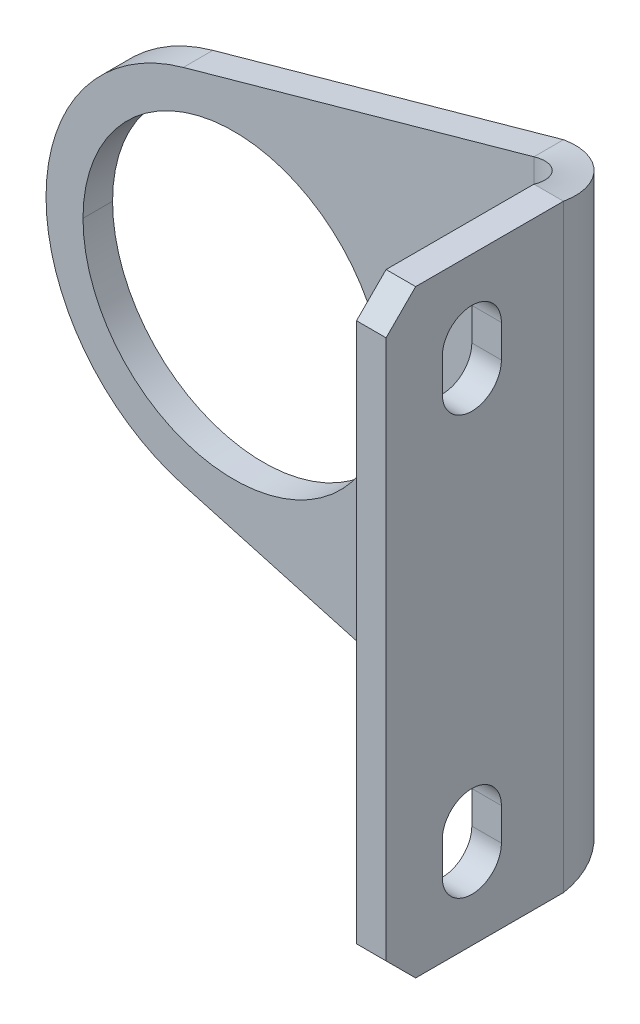
ISO-10303-21;
HEADER;
FILE_DESCRIPTION(('STEP AP214'),'2;1');
FILE_NAME('part.step','',(''),(''),'','','');
FILE_SCHEMA(('AUTOMOTIVE_DESIGN { 1 0 10303 214 1 1 1 1 }'));
ENDSEC;
DATA;
#1=APPLICATION_CONTEXT('core data for automotive mechanical design processes');
#2=APPLICATION_PROTOCOL_DEFINITION('international standard','automotive_design',2000,#1);
#3=PRODUCT_CONTEXT('',#1,'mechanical');
#4=PRODUCT('Part','Part','',(#3));
#5=PRODUCT_RELATED_PRODUCT_CATEGORY('part','',(#4));
#6=PRODUCT_DEFINITION_FORMATION('','',#4);
#7=PRODUCT_DEFINITION_CONTEXT('part definition',#1,'design');
#8=PRODUCT_DEFINITION('design','',#6,#7);
#9=PRODUCT_DEFINITION_SHAPE('','',#8);
#10=(LENGTH_UNIT() NAMED_UNIT(*) SI_UNIT(.MILLI.,.METRE.));
#11=(NAMED_UNIT(*) PLANE_ANGLE_UNIT() SI_UNIT($,.RADIAN.));
#12=(NAMED_UNIT(*) SI_UNIT($,.STERADIAN.) SOLID_ANGLE_UNIT());
#13=UNCERTAINTY_MEASURE_WITH_UNIT(LENGTH_MEASURE(1.E-05),#10,'distance_accuracy_value','');
#14=(GEOMETRIC_REPRESENTATION_CONTEXT(3) GLOBAL_UNCERTAINTY_ASSIGNED_CONTEXT((#13)) GLOBAL_UNIT_ASSIGNED_CONTEXT((#10,
#11,#12)) REPRESENTATION_CONTEXT('',''));
#15=CARTESIAN_POINT('',(0.,0.,0.));
#16=DIRECTION('',(0.,0.,1.));
#17=DIRECTION('',(1.,0.,0.));
#18=AXIS2_PLACEMENT_3D('',#15,#16,#17);
#19=CARTESIAN_POINT('',(25.3,13.05,13.2));
#20=DIRECTION('',(0.,0.,1.));
#21=DIRECTION('',(1.,0.,0.));
#22=AXIS2_PLACEMENT_3D('',#19,#20,#21);
#23=PLANE('',#22);
#24=DIRECTION('',(0.,1.,0.));
#25=VECTOR('',#24,1.);
#26=CARTESIAN_POINT('',(23.3,13.05,13.2));
#27=LINE('',#26,#25);
#28=CARTESIAN_POINT('',(23.3,13.05,13.2));
#29=VERTEX_POINT('',#28);
#30=CARTESIAN_POINT('',(23.3,15.25,13.2));
#31=VERTEX_POINT('',#30);
#32=EDGE_CURVE('E288',#29,#31,#27,.T.);
#33=ORIENTED_EDGE('',*,*,#32,.T.);
#34=DIRECTION('',(-1.,0.,0.));
#35=VECTOR('',#34,1.);
#36=CARTESIAN_POINT('',(25.3,15.25,13.2));
#37=LINE('',#36,#35);
#38=CARTESIAN_POINT('',(25.3,15.25,13.2));
#39=VERTEX_POINT('',#38);
#40=EDGE_CURVE('E9',#39,#31,#37,.T.);
#41=ORIENTED_EDGE('',*,*,#40,.F.);
#42=DIRECTION('',(0.,1.,0.));
#43=VECTOR('',#42,1.);
#44=CARTESIAN_POINT('',(25.3,13.05,13.2));
#45=LINE('',#44,#43);
#46=CARTESIAN_POINT('',(25.3,13.05,13.2));
#47=VERTEX_POINT('',#46);
#48=EDGE_CURVE('E314',#47,#39,#45,.T.);
#49=ORIENTED_EDGE('',*,*,#48,.F.);
#50=DIRECTION('',(-1.,0.,0.));
#51=VECTOR('',#50,1.);
#52=CARTESIAN_POINT('',(25.3,13.05,13.2));
#53=LINE('',#52,#51);
#54=EDGE_CURVE('E280',#47,#29,#53,.T.);
#55=ORIENTED_EDGE('',*,*,#54,.T.);
#56=EDGE_LOOP('',(#33,#41,#49,#55));
#57=FACE_BOUND('',#56,.T.);
#58=ADVANCED_FACE('F15',(#57),#23,.F.);
#59=CARTESIAN_POINT('',(25.3,15.25,11.2));
#60=DIRECTION('',(-1.,0.,0.));
#61=DIRECTION('',(0.,0.,1.));
#62=AXIS2_PLACEMENT_3D('',#59,#60,#61);
#63=CYLINDRICAL_SURFACE('',#62,2.);
#64=CARTESIAN_POINT('',(23.3,15.25,11.2));
#65=DIRECTION('',(-1.,0.,0.));
#66=DIRECTION('',(0.,0.,1.));
#67=AXIS2_PLACEMENT_3D('',#64,#65,#66);
#68=CIRCLE('',#67,2.);
#69=CARTESIAN_POINT('',(23.3,15.25,9.2));
#70=VERTEX_POINT('',#69);
#71=EDGE_CURVE('E373',#31,#70,#68,.T.);
#72=ORIENTED_EDGE('',*,*,#71,.T.);
#73=DIRECTION('',(-1.,0.,0.));
#74=VECTOR('',#73,1.);
#75=CARTESIAN_POINT('',(25.3,15.25,9.2));
#76=LINE('',#75,#74);
#77=CARTESIAN_POINT('',(25.3,15.25,9.2));
#78=VERTEX_POINT('',#77);
#79=EDGE_CURVE('E25',#78,#70,#76,.T.);
#80=ORIENTED_EDGE('',*,*,#79,.F.);
#81=CARTESIAN_POINT('',(25.3,15.25,11.2));
#82=DIRECTION('',(-1.,0.,0.));
#83=DIRECTION('',(0.,0.,1.));
#84=AXIS2_PLACEMENT_3D('',#81,#82,#83);
#85=CIRCLE('',#84,2.);
#86=EDGE_CURVE('E331',#39,#78,#85,.T.);
#87=ORIENTED_EDGE('',*,*,#86,.F.);
#88=ORIENTED_EDGE('',*,*,#40,.T.);
#89=EDGE_LOOP('',(#72,#80,#87,#88));
#90=FACE_BOUND('',#89,.T.);
#91=ADVANCED_FACE('F17',(#90),#63,.F.);
#92=CARTESIAN_POINT('',(25.3,13.05,9.2));
#93=DIRECTION('',(0.,0.,-1.));
#94=DIRECTION('',(-1.,0.,0.));
#95=AXIS2_PLACEMENT_3D('',#92,#93,#94);
#96=PLANE('',#95);
#97=DIRECTION('',(0.,-1.,0.));
#98=VECTOR('',#97,1.);
#99=CARTESIAN_POINT('',(23.3,13.05,9.2));
#100=LINE('',#99,#98);
#101=CARTESIAN_POINT('',(23.3,13.05,9.2));
#102=VERTEX_POINT('',#101);
#103=EDGE_CURVE('E369',#70,#102,#100,.T.);
#104=ORIENTED_EDGE('',*,*,#103,.T.);
#105=DIRECTION('',(-1.,0.,0.));
#106=VECTOR('',#105,1.);
#107=CARTESIAN_POINT('',(25.3,13.05,9.2));
#108=LINE('',#107,#106);
#109=CARTESIAN_POINT('',(25.3,13.05,9.2));
#110=VERTEX_POINT('',#109);
#111=EDGE_CURVE('E273',#110,#102,#108,.T.);
#112=ORIENTED_EDGE('',*,*,#111,.F.);
#113=DIRECTION('',(0.,-1.,0.));
#114=VECTOR('',#113,1.);
#115=CARTESIAN_POINT('',(25.3,13.05,9.2));
#116=LINE('',#115,#114);
#117=EDGE_CURVE('E251',#78,#110,#116,.T.);
#118=ORIENTED_EDGE('',*,*,#117,.F.);
#119=ORIENTED_EDGE('',*,*,#79,.T.);
#120=EDGE_LOOP('',(#104,#112,#118,#119));
#121=FACE_BOUND('',#120,.T.);
#122=ADVANCED_FACE('F1172',(#121),#96,.F.);
#123=CARTESIAN_POINT('',(25.3,13.05,11.2));
#124=DIRECTION('',(-1.,0.,0.));
#125=DIRECTION('',(0.,0.,1.));
#126=AXIS2_PLACEMENT_3D('',#123,#124,#125);
#127=CYLINDRICAL_SURFACE('',#126,2.);
#128=CARTESIAN_POINT('',(23.3,13.05,11.2));
#129=DIRECTION('',(-1.,0.,0.));
#130=DIRECTION('',(0.,0.,1.));
#131=AXIS2_PLACEMENT_3D('',#128,#129,#130);
#132=CIRCLE('',#131,2.);
#133=EDGE_CURVE('E364',#102,#29,#132,.T.);
#134=ORIENTED_EDGE('',*,*,#133,.T.);
#135=ORIENTED_EDGE('',*,*,#54,.F.);
#136=CARTESIAN_POINT('',(25.3,13.05,11.2));
#137=DIRECTION('',(-1.,0.,0.));
#138=DIRECTION('',(0.,0.,1.));
#139=AXIS2_PLACEMENT_3D('',#136,#137,#138);
#140=CIRCLE('',#139,2.);
#141=EDGE_CURVE('E260',#110,#47,#140,.T.);
#142=ORIENTED_EDGE('',*,*,#141,.F.);
#143=ORIENTED_EDGE('',*,*,#111,.T.);
#144=EDGE_LOOP('',(#134,#135,#142,#143));
#145=FACE_BOUND('',#144,.T.);
#146=ADVANCED_FACE('F1162',(#145),#127,.F.);
#147=CARTESIAN_POINT('',(25.3,-13.05,9.2));
#148=DIRECTION('',(0.,0.,-1.));
#149=DIRECTION('',(-1.,0.,0.));
#150=AXIS2_PLACEMENT_3D('',#147,#148,#149);
#151=PLANE('',#150);
#152=DIRECTION('',(0.,-1.,0.));
#153=VECTOR('',#152,1.);
#154=CARTESIAN_POINT('',(23.3,-13.05,9.2));
#155=LINE('',#154,#153);
#156=CARTESIAN_POINT('',(23.3,-13.05,9.2));
#157=VERTEX_POINT('',#156);
#158=CARTESIAN_POINT('',(23.3,-15.25,9.2));
#159=VERTEX_POINT('',#158);
#160=EDGE_CURVE('E307',#157,#159,#155,.T.);
#161=ORIENTED_EDGE('',*,*,#160,.T.);
#162=DIRECTION('',(-1.,0.,0.));
#163=VECTOR('',#162,1.);
#164=CARTESIAN_POINT('',(25.3,-15.25,9.2));
#165=LINE('',#164,#163);
#166=CARTESIAN_POINT('',(25.3,-15.25,9.2));
#167=VERTEX_POINT('',#166);
#168=EDGE_CURVE('E39',#167,#159,#165,.T.);
#169=ORIENTED_EDGE('',*,*,#168,.F.);
#170=DIRECTION('',(0.,-1.,0.));
#171=VECTOR('',#170,1.);
#172=CARTESIAN_POINT('',(25.3,-13.05,9.2));
#173=LINE('',#172,#171);
#174=CARTESIAN_POINT('',(25.3,-13.05,9.2));
#175=VERTEX_POINT('',#174);
#176=EDGE_CURVE('E350',#175,#167,#173,.T.);
#177=ORIENTED_EDGE('',*,*,#176,.F.);
#178=DIRECTION('',(-1.,0.,0.));
#179=VECTOR('',#178,1.);
#180=CARTESIAN_POINT('',(25.3,-13.05,9.2));
#181=LINE('',#180,#179);
#182=EDGE_CURVE('E387',#175,#157,#181,.T.);
#183=ORIENTED_EDGE('',*,*,#182,.T.);
#184=EDGE_LOOP('',(#161,#169,#177,#183));
#185=FACE_BOUND('',#184,.T.);
#186=ADVANCED_FACE('F1151',(#185),#151,.F.);
#187=CARTESIAN_POINT('',(25.3,-15.25,11.2));
#188=DIRECTION('',(-1.,0.,0.));
#189=DIRECTION('',(0.,0.,1.));
#190=AXIS2_PLACEMENT_3D('',#187,#188,#189);
#191=CYLINDRICAL_SURFACE('',#190,2.);
#192=CARTESIAN_POINT('',(23.3,-15.25,11.2));
#193=DIRECTION('',(-1.,0.,0.));
#194=DIRECTION('',(0.,0.,-1.));
#195=AXIS2_PLACEMENT_3D('',#192,#193,#194);
#196=CIRCLE('',#195,2.);
#197=CARTESIAN_POINT('',(23.3,-15.25,13.2));
#198=VERTEX_POINT('',#197);
#199=EDGE_CURVE('E306',#159,#198,#196,.T.);
#200=ORIENTED_EDGE('',*,*,#199,.T.);
#201=DIRECTION('',(-1.,0.,0.));
#202=VECTOR('',#201,1.);
#203=CARTESIAN_POINT('',(25.3,-15.25,13.2));
#204=LINE('',#203,#202);
#205=CARTESIAN_POINT('',(25.3,-15.25,13.2));
#206=VERTEX_POINT('',#205);
#207=EDGE_CURVE('E49',#206,#198,#204,.T.);
#208=ORIENTED_EDGE('',*,*,#207,.F.);
#209=CARTESIAN_POINT('',(25.3,-15.25,11.2));
#210=DIRECTION('',(-1.,0.,0.));
#211=DIRECTION('',(0.,0.,-1.));
#212=AXIS2_PLACEMENT_3D('',#209,#210,#211);
#213=CIRCLE('',#212,2.);
#214=EDGE_CURVE('E349',#167,#206,#213,.T.);
#215=ORIENTED_EDGE('',*,*,#214,.F.);
#216=ORIENTED_EDGE('',*,*,#168,.T.);
#217=EDGE_LOOP('',(#200,#208,#215,#216));
#218=FACE_BOUND('',#217,.T.);
#219=ADVANCED_FACE('F1137',(#218),#191,.F.);
#220=CARTESIAN_POINT('',(25.3,-13.05,13.2));
#221=DIRECTION('',(0.,0.,1.));
#222=DIRECTION('',(1.,0.,0.));
#223=AXIS2_PLACEMENT_3D('',#220,#221,#222);
#224=PLANE('',#223);
#225=DIRECTION('',(0.,1.,0.));
#226=VECTOR('',#225,1.);
#227=CARTESIAN_POINT('',(23.3,-13.05,13.2));
#228=LINE('',#227,#226);
#229=CARTESIAN_POINT('',(23.3,-13.05,13.2));
#230=VERTEX_POINT('',#229);
#231=EDGE_CURVE('E286',#198,#230,#228,.T.);
#232=ORIENTED_EDGE('',*,*,#231,.T.);
#233=DIRECTION('',(-1.,0.,0.));
#234=VECTOR('',#233,1.);
#235=CARTESIAN_POINT('',(25.3,-13.05,13.2));
#236=LINE('',#235,#234);
#237=CARTESIAN_POINT('',(25.3,-13.05,13.2));
#238=VERTEX_POINT('',#237);
#239=EDGE_CURVE('E386',#238,#230,#236,.T.);
#240=ORIENTED_EDGE('',*,*,#239,.F.);
#241=DIRECTION('',(0.,1.,0.));
#242=VECTOR('',#241,1.);
#243=CARTESIAN_POINT('',(25.3,-13.05,13.2));
#244=LINE('',#243,#242);
#245=EDGE_CURVE('E339',#206,#238,#244,.T.);
#246=ORIENTED_EDGE('',*,*,#245,.F.);
#247=ORIENTED_EDGE('',*,*,#207,.T.);
#248=EDGE_LOOP('',(#232,#240,#246,#247));
#249=FACE_BOUND('',#248,.T.);
#250=ADVANCED_FACE('F1128',(#249),#224,.F.);
#251=CARTESIAN_POINT('',(25.3,-13.05,11.2));
#252=DIRECTION('',(-1.,0.,0.));
#253=DIRECTION('',(0.,0.,1.));
#254=AXIS2_PLACEMENT_3D('',#251,#252,#253);
#255=CYLINDRICAL_SURFACE('',#254,2.);
#256=CARTESIAN_POINT('',(23.3,-13.05,11.2));
#257=DIRECTION('',(-1.,0.,0.));
#258=DIRECTION('',(0.,0.,-1.));
#259=AXIS2_PLACEMENT_3D('',#256,#257,#258);
#260=CIRCLE('',#259,2.);
#261=EDGE_CURVE('E287',#230,#157,#260,.T.);
#262=ORIENTED_EDGE('',*,*,#261,.T.);
#263=ORIENTED_EDGE('',*,*,#182,.F.);
#264=CARTESIAN_POINT('',(25.3,-13.05,11.2));
#265=DIRECTION('',(-1.,0.,0.));
#266=DIRECTION('',(0.,0.,-1.));
#267=AXIS2_PLACEMENT_3D('',#264,#265,#266);
#268=CIRCLE('',#267,2.);
#269=EDGE_CURVE('E345',#238,#175,#268,.T.);
#270=ORIENTED_EDGE('',*,*,#269,.F.);
#271=ORIENTED_EDGE('',*,*,#239,.T.);
#272=EDGE_LOOP('',(#262,#263,#270,#271));
#273=FACE_BOUND('',#272,.T.);
#274=ADVANCED_FACE('F1120',(#273),#255,.F.);
#275=CARTESIAN_POINT('',(25.3,18.25,17.));
#276=DIRECTION('',(0.,-0.707106781186549,-0.707106781186546));
#277=DIRECTION('',(0.,0.707106781186546,-0.707106781186549));
#278=AXIS2_PLACEMENT_3D('',#275,#276,#277);
#279=PLANE('',#278);
#280=DIRECTION('',(0.,-0.707106781186546,0.707106781186549));
#281=VECTOR('',#280,1.);
#282=CARTESIAN_POINT('',(25.3,18.25,17.));
#283=LINE('',#282,#281);
#284=CARTESIAN_POINT('',(25.3,20.25,15.));
#285=VERTEX_POINT('',#284);
#286=CARTESIAN_POINT('',(25.3,18.25,17.));
#287=VERTEX_POINT('',#286);
#288=EDGE_CURVE('E256',#285,#287,#283,.T.);
#289=ORIENTED_EDGE('',*,*,#288,.F.);
#290=DIRECTION('',(1.,0.,0.));
#291=VECTOR('',#290,1.);
#292=CARTESIAN_POINT('',(25.3,20.25,15.));
#293=LINE('',#292,#291);
#294=CARTESIAN_POINT('',(23.3,20.25,15.));
#295=VERTEX_POINT('',#294);
#296=EDGE_CURVE('E243',#295,#285,#293,.T.);
#297=ORIENTED_EDGE('',*,*,#296,.F.);
#298=DIRECTION('',(0.,0.707106781186546,-0.707106781186549));
#299=VECTOR('',#298,1.);
#300=CARTESIAN_POINT('',(23.3,17.625,17.625));
#301=LINE('',#300,#299);
#302=CARTESIAN_POINT('',(23.3,18.25,17.));
#303=VERTEX_POINT('',#302);
#304=EDGE_CURVE('E362',#303,#295,#301,.T.);
#305=ORIENTED_EDGE('',*,*,#304,.F.);
#306=DIRECTION('',(-1.,0.,0.));
#307=VECTOR('',#306,1.);
#308=CARTESIAN_POINT('',(25.3,18.25,17.));
#309=LINE('',#308,#307);
#310=EDGE_CURVE('E308',#287,#303,#309,.T.);
#311=ORIENTED_EDGE('',*,*,#310,.F.);
#312=EDGE_LOOP('',(#289,#297,#305,#311));
#313=FACE_BOUND('',#312,.T.);
#314=ADVANCED_FACE('F1101',(#313),#279,.F.);
#315=CARTESIAN_POINT('',(25.3,-20.25,15.));
#316=DIRECTION('',(0.,0.707106781186546,-0.707106781186549));
#317=DIRECTION('',(-1.,0.,0.));
#318=AXIS2_PLACEMENT_3D('',#315,#316,#317);
#319=PLANE('',#318);
#320=DIRECTION('',(0.,-0.707106781186549,-0.707106781186546));
#321=VECTOR('',#320,1.);
#322=CARTESIAN_POINT('',(25.3,-20.25,15.));
#323=LINE('',#322,#321);
#324=CARTESIAN_POINT('',(25.3,-18.25,17.));
#325=VERTEX_POINT('',#324);
#326=CARTESIAN_POINT('',(25.3,-20.25,15.));
#327=VERTEX_POINT('',#326);
#328=EDGE_CURVE('E324',#325,#327,#323,.T.);
#329=ORIENTED_EDGE('',*,*,#328,.F.);
#330=DIRECTION('',(1.,0.,0.));
#331=VECTOR('',#330,1.);
#332=CARTESIAN_POINT('',(25.3,-18.25,17.));
#333=LINE('',#332,#331);
#334=CARTESIAN_POINT('',(23.3,-18.25,17.));
#335=VERTEX_POINT('',#334);
#336=EDGE_CURVE('E303',#335,#325,#333,.T.);
#337=ORIENTED_EDGE('',*,*,#336,.F.);
#338=DIRECTION('',(0.,0.707106781186549,0.707106781186546));
#339=VECTOR('',#338,1.);
#340=CARTESIAN_POINT('',(23.3,-17.625,17.625));
#341=LINE('',#340,#339);
#342=CARTESIAN_POINT('',(23.3,-20.25,15.));
#343=VERTEX_POINT('',#342);
#344=EDGE_CURVE('E353',#343,#335,#341,.T.);
#345=ORIENTED_EDGE('',*,*,#344,.F.);
#346=DIRECTION('',(-1.,0.,0.));
#347=VECTOR('',#346,1.);
#348=CARTESIAN_POINT('',(25.3,-20.25,15.));
#349=LINE('',#348,#347);
#350=EDGE_CURVE('E312',#327,#343,#349,.T.);
#351=ORIENTED_EDGE('',*,*,#350,.F.);
#352=EDGE_LOOP('',(#329,#337,#345,#351));
#353=FACE_BOUND('',#352,.T.);
#354=ADVANCED_FACE('F1095',(#353),#319,.F.);
#355=CARTESIAN_POINT('',(25.3,-20.25,17.));
#356=DIRECTION('',(0.,0.,-1.));
#357=DIRECTION('',(-1.,0.,0.));
#358=AXIS2_PLACEMENT_3D('',#355,#356,#357);
#359=PLANE('',#358);
#360=DIRECTION('',(0.,-1.,0.));
#361=VECTOR('',#360,1.);
#362=CARTESIAN_POINT('',(23.3,-20.25,17.));
#363=LINE('',#362,#361);
#364=EDGE_CURVE('E358',#303,#335,#363,.T.);
#365=ORIENTED_EDGE('',*,*,#364,.T.);
#366=ORIENTED_EDGE('',*,*,#336,.T.);
#367=DIRECTION('',(0.,-1.,0.));
#368=VECTOR('',#367,1.);
#369=CARTESIAN_POINT('',(25.3,0.,17.));
#370=LINE('',#369,#368);
#371=EDGE_CURVE('E321',#287,#325,#370,.T.);
#372=ORIENTED_EDGE('',*,*,#371,.F.);
#373=ORIENTED_EDGE('',*,*,#310,.T.);
#374=EDGE_LOOP('',(#365,#366,#372,#373));
#375=FACE_BOUND('',#374,.T.);
#376=ADVANCED_FACE('F1079',(#375),#359,.F.);
#377=CARTESIAN_POINT('',(23.3,0.,0.));
#378=DIRECTION('',(-1.,0.,0.));
#379=DIRECTION('',(0.,1.,0.));
#380=AXIS2_PLACEMENT_3D('',#377,#378,#379);
#381=PLANE('',#380);
#382=ORIENTED_EDGE('',*,*,#261,.F.);
#383=ORIENTED_EDGE('',*,*,#231,.F.);
#384=ORIENTED_EDGE('',*,*,#199,.F.);
#385=ORIENTED_EDGE('',*,*,#160,.F.);
#386=EDGE_LOOP('',(#382,#383,#384,#385));
#387=FACE_BOUND('',#386,.T.);
#388=ORIENTED_EDGE('',*,*,#133,.F.);
#389=ORIENTED_EDGE('',*,*,#103,.F.);
#390=ORIENTED_EDGE('',*,*,#71,.F.);
#391=ORIENTED_EDGE('',*,*,#32,.F.);
#392=EDGE_LOOP('',(#388,#389,#390,#391));
#393=FACE_BOUND('',#392,.T.);
#394=DIRECTION('',(0.,0.,-1.));
#395=VECTOR('',#394,1.);
#396=CARTESIAN_POINT('',(23.3,-20.25,2.));
#397=LINE('',#396,#395);
#398=CARTESIAN_POINT('',(23.3,-20.25,5.));
#399=VERTEX_POINT('',#398);
#400=EDGE_CURVE('E317',#343,#399,#397,.T.);
#401=ORIENTED_EDGE('',*,*,#400,.F.);
#402=ORIENTED_EDGE('',*,*,#344,.T.);
#403=ORIENTED_EDGE('',*,*,#364,.F.);
#404=ORIENTED_EDGE('',*,*,#304,.T.);
#405=DIRECTION('',(0.,0.,1.));
#406=VECTOR('',#405,1.);
#407=CARTESIAN_POINT('',(23.3,20.25,17.));
#408=LINE('',#407,#406);
#409=CARTESIAN_POINT('',(23.3,20.25,5.));
#410=VERTEX_POINT('',#409);
#411=EDGE_CURVE('E247',#410,#295,#408,.T.);
#412=ORIENTED_EDGE('',*,*,#411,.F.);
#413=DIRECTION('',(0.,1.,0.));
#414=VECTOR('',#413,1.);
#415=CARTESIAN_POINT('',(23.3,-20.25,5.));
#416=LINE('',#415,#414);
#417=EDGE_CURVE('E455',#399,#410,#416,.T.);
#418=ORIENTED_EDGE('',*,*,#417,.F.);
#419=EDGE_LOOP('',(#401,#402,#403,#404,#412,#418));
#420=FACE_BOUND('',#419,.T.);
#421=ADVANCED_FACE('F522',(#387,#393,#420),#381,.T.);
#422=CARTESIAN_POINT('',(25.3,0.,0.));
#423=DIRECTION('',(-1.,0.,0.));
#424=DIRECTION('',(0.,1.,0.));
#425=AXIS2_PLACEMENT_3D('',#422,#423,#424);
#426=PLANE('',#425);
#427=ORIENTED_EDGE('',*,*,#245,.T.);
#428=ORIENTED_EDGE('',*,*,#269,.T.);
#429=ORIENTED_EDGE('',*,*,#176,.T.);
#430=ORIENTED_EDGE('',*,*,#214,.T.);
#431=EDGE_LOOP('',(#427,#428,#429,#430));
#432=FACE_BOUND('',#431,.T.);
#433=ORIENTED_EDGE('',*,*,#117,.T.);
#434=ORIENTED_EDGE('',*,*,#141,.T.);
#435=ORIENTED_EDGE('',*,*,#48,.T.);
#436=ORIENTED_EDGE('',*,*,#86,.T.);
#437=EDGE_LOOP('',(#433,#434,#435,#436));
#438=FACE_BOUND('',#437,.T.);
#439=ORIENTED_EDGE('',*,*,#371,.T.);
#440=ORIENTED_EDGE('',*,*,#328,.T.);
#441=DIRECTION('',(0.,0.,-1.));
#442=VECTOR('',#441,1.);
#443=CARTESIAN_POINT('',(25.3,-20.25,0.));
#444=LINE('',#443,#442);
#445=CARTESIAN_POINT('',(25.3,-20.25,5.));
#446=VERTEX_POINT('',#445);
#447=EDGE_CURVE('E319',#327,#446,#444,.T.);
#448=ORIENTED_EDGE('',*,*,#447,.T.);
#449=DIRECTION('',(0.,-1.,0.));
#450=VECTOR('',#449,1.);
#451=CARTESIAN_POINT('',(25.3,-20.25,5.));
#452=LINE('',#451,#450);
#453=CARTESIAN_POINT('',(25.3,20.25,5.));
#454=VERTEX_POINT('',#453);
#455=EDGE_CURVE('E460',#454,#446,#452,.T.);
#456=ORIENTED_EDGE('',*,*,#455,.F.);
#457=DIRECTION('',(0.,0.,1.));
#458=VECTOR('',#457,1.);
#459=CARTESIAN_POINT('',(25.3,20.25,0.));
#460=LINE('',#459,#458);
#461=EDGE_CURVE('E248',#454,#285,#460,.T.);
#462=ORIENTED_EDGE('',*,*,#461,.T.);
#463=ORIENTED_EDGE('',*,*,#288,.T.);
#464=EDGE_LOOP('',(#439,#440,#448,#456,#462,#463));
#465=FACE_BOUND('',#464,.T.);
#466=ADVANCED_FACE('F998',(#432,#438,#465),#426,.F.);
#467=CARTESIAN_POINT('',(25.3,20.25,17.));
#468=DIRECTION('',(0.,-1.,0.));
#469=DIRECTION('',(0.,0.,-1.));
#470=AXIS2_PLACEMENT_3D('',#467,#468,#469);
#471=PLANE('',#470);
#472=ORIENTED_EDGE('',*,*,#411,.T.);
#473=ORIENTED_EDGE('',*,*,#296,.T.);
#474=ORIENTED_EDGE('',*,*,#461,.F.);
#475=DIRECTION('',(1.,0.,0.));
#476=VECTOR('',#475,1.);
#477=CARTESIAN_POINT('',(23.3,20.25,5.));
#478=LINE('',#477,#476);
#479=EDGE_CURVE('E590',#410,#454,#478,.T.);
#480=ORIENTED_EDGE('',*,*,#479,.F.);
#481=EDGE_LOOP('',(#472,#473,#474,#480));
#482=FACE_BOUND('',#481,.T.);
#483=ADVANCED_FACE('F991',(#482),#471,.F.);
#484=CARTESIAN_POINT('',(25.3,-20.25,2.));
#485=DIRECTION('',(0.,1.,0.));
#486=DIRECTION('',(1.,0.,0.));
#487=AXIS2_PLACEMENT_3D('',#484,#485,#486);
#488=PLANE('',#487);
#489=ORIENTED_EDGE('',*,*,#447,.F.);
#490=ORIENTED_EDGE('',*,*,#350,.T.);
#491=ORIENTED_EDGE('',*,*,#400,.T.);
#492=DIRECTION('',(1.,0.,0.));
#493=VECTOR('',#492,1.);
#494=CARTESIAN_POINT('',(25.3,-20.25,5.));
#495=LINE('',#494,#493);
#496=EDGE_CURVE('E301',#399,#446,#495,.T.);
#497=ORIENTED_EDGE('',*,*,#496,.T.);
#498=EDGE_LOOP('',(#489,#490,#491,#497));
#499=FACE_BOUND('',#498,.T.);
#500=ADVANCED_FACE('F424',(#499),#488,.F.);
#501=CARTESIAN_POINT('',(20.3,20.25,5.));
#502=DIRECTION('',(0.,1.,0.));
#503=DIRECTION('',(1.,0.,0.));
#504=AXIS2_PLACEMENT_3D('',#501,#502,#503);
#505=CYLINDRICAL_SURFACE('',#504,3.);
#506=DIRECTION('',(0.,-1.,0.));
#507=VECTOR('',#506,1.);
#508=CARTESIAN_POINT('',(20.3,20.25,2.));
#509=LINE('',#508,#507);
#510=CARTESIAN_POINT('',(20.3,18.8539079333565,2.));
#511=VERTEX_POINT('',#510);
#512=CARTESIAN_POINT('',(20.3,-18.8539079333565,2.));
#513=VERTEX_POINT('',#512);
#514=EDGE_CURVE('E465',#511,#513,#509,.T.);
#515=ORIENTED_EDGE('',*,*,#514,.T.);
#516=CARTESIAN_POINT('',(23.3,-20.25,5.));
#517=CARTESIAN_POINT('',(23.3,-20.1336397109881,4.60723582864231));
#518=CARTESIAN_POINT('',(23.221918030005,-20.0173179888928,4.21475634692215));
#519=CARTESIAN_POINT('',(22.9213591650628,-19.7846359777855,3.48914305888729));
#520=CARTESIAN_POINT('',(22.6990005271945,-19.6682949722319,3.15635984007525));
#521=CARTESIAN_POINT('',(22.1436401599248,-19.4356129611247,2.60099947280546));
#522=CARTESIAN_POINT('',(21.8108569411127,-19.319271955571,2.37864083493722));
#523=CARTESIAN_POINT('',(21.0852436530778,-19.0865899444637,2.07808196999505));
#524=CARTESIAN_POINT('',(20.6927641713577,-18.9702682223684,2.));
#525=CARTESIAN_POINT('',(20.3,-18.8539079333565,2.));
#526=(BOUNDED_CURVE() B_SPLINE_CURVE(3,(#516,#517,#518,#519,#520,#521,#522,#523,#524,#525),
.UNSPECIFIED.,.F.,.F.) B_SPLINE_CURVE_WITH_KNOTS((4,2,2,2,4),(0.,0.25,0.5,0.75,1.),
.UNSPECIFIED.) CURVE() GEOMETRIC_REPRESENTATION_ITEM() RATIONAL_B_SPLINE_CURVE((1.,1.,1.,1.,1.,
1.,1.,1.,1.,1.)) REPRESENTATION_ITEM(''));
#527=EDGE_CURVE('E527',#513,#399,#526,.F.);
#528=ORIENTED_EDGE('',*,*,#527,.T.);
#529=ORIENTED_EDGE('',*,*,#417,.T.);
#530=CARTESIAN_POINT('',(20.3,18.8539079333565,2.));
#531=CARTESIAN_POINT('',(20.6927641713577,18.9702682223684,2.));
#532=CARTESIAN_POINT('',(21.0852436530778,19.0865899444637,2.07808196999505));
#533=CARTESIAN_POINT('',(21.8108569411127,19.319271955571,2.37864083493722));
#534=CARTESIAN_POINT('',(22.1436401599248,19.4356129611247,2.60099947280546));
#535=CARTESIAN_POINT('',(22.6990005271945,19.6682949722319,3.15635984007525));
#536=CARTESIAN_POINT('',(22.9213591650628,19.7846359777855,3.48914305888729));
#537=CARTESIAN_POINT('',(23.221918030005,20.0173179888928,4.21475634692214));
#538=CARTESIAN_POINT('',(23.3,20.1336397109881,4.60723582864231));
#539=CARTESIAN_POINT('',(23.3,20.25,5.));
#540=(BOUNDED_CURVE() B_SPLINE_CURVE(3,(#530,#531,#532,#533,#534,#535,#536,#537,#538,#539),
.UNSPECIFIED.,.F.,.F.) B_SPLINE_CURVE_WITH_KNOTS((4,2,2,2,4),(0.,0.25,0.5,0.75,1.),
.UNSPECIFIED.) CURVE() GEOMETRIC_REPRESENTATION_ITEM() RATIONAL_B_SPLINE_CURVE((1.,1.,1.,1.,1.,
1.,1.,1.,1.,1.)) REPRESENTATION_ITEM(''));
#541=EDGE_CURVE('E587',#410,#511,#540,.F.);
#542=ORIENTED_EDGE('',*,*,#541,.T.);
#543=EDGE_LOOP('',(#515,#528,#529,#542));
#544=FACE_BOUND('',#543,.T.);
#545=ADVANCED_FACE('F426',(#544),#505,.F.);
#546=CARTESIAN_POINT('',(20.3,20.25,5.));
#547=DIRECTION('',(0.,1.,0.));
#548=DIRECTION('',(1.,0.,0.));
#549=AXIS2_PLACEMENT_3D('',#546,#547,#548);
#550=CYLINDRICAL_SURFACE('',#549,5.);
#551=DIRECTION('',(0.,-1.,0.));
#552=VECTOR('',#551,1.);
#553=CARTESIAN_POINT('',(20.3,20.25,0.));
#554=LINE('',#553,#552);
#555=CARTESIAN_POINT('',(20.3,18.8539079333565,0.));
#556=VERTEX_POINT('',#555);
#557=CARTESIAN_POINT('',(20.3,-18.8539079333565,0.));
#558=VERTEX_POINT('',#557);
#559=EDGE_CURVE('E224',#556,#558,#554,.T.);
#560=ORIENTED_EDGE('',*,*,#559,.F.);
#561=CARTESIAN_POINT('',(25.3,20.25,5.));
#562=CARTESIAN_POINT('',(25.3,20.1336386609607,4.34538714060855));
#563=CARTESIAN_POINT('',(25.1698633833416,20.0173179888928,3.69126057820358));
#564=CARTESIAN_POINT('',(24.6689319417713,19.7846359777855,2.4819050981455));
#565=CARTESIAN_POINT('',(24.2983342119909,19.6682949722319,1.92726640012542));
#566=CARTESIAN_POINT('',(23.3727335998746,19.4356129611247,1.0016657880091));
#567=CARTESIAN_POINT('',(22.8180949018545,19.319271955571,0.631068058228713));
#568=CARTESIAN_POINT('',(21.6087394217964,19.0865899444637,0.130136616658428));
#569=CARTESIAN_POINT('',(20.9546128593914,18.9702692723958,0.));
#570=CARTESIAN_POINT('',(20.3,18.8539079333565,0.));
#571=(BOUNDED_CURVE() B_SPLINE_CURVE(3,(#561,#562,#563,#564,#565,#566,#567,#568,#569,#570),
.UNSPECIFIED.,.F.,.F.) B_SPLINE_CURVE_WITH_KNOTS((4,2,2,2,4),(0.,0.25,0.5,0.75,1.),
.UNSPECIFIED.) CURVE() GEOMETRIC_REPRESENTATION_ITEM() RATIONAL_B_SPLINE_CURVE((1.,1.,1.,1.,1.,
1.,1.,1.,1.,1.)) REPRESENTATION_ITEM(''));
#572=EDGE_CURVE('E403',#454,#556,#571,.T.);
#573=ORIENTED_EDGE('',*,*,#572,.F.);
#574=ORIENTED_EDGE('',*,*,#455,.T.);
#575=CARTESIAN_POINT('',(20.3,-18.8539079333565,0.));
#576=CARTESIAN_POINT('',(20.9546128593914,-18.9702692723958,0.));
#577=CARTESIAN_POINT('',(21.6087394217964,-19.0865899444637,0.130136616658428));
#578=CARTESIAN_POINT('',(22.8180949018545,-19.319271955571,0.631068058228713));
#579=CARTESIAN_POINT('',(23.3727335998746,-19.4356129611247,1.0016657880091));
#580=CARTESIAN_POINT('',(24.2983342119909,-19.6682949722319,1.92726640012542));
#581=CARTESIAN_POINT('',(24.6689319417713,-19.7846359777855,2.4819050981455));
#582=CARTESIAN_POINT('',(25.1698633833416,-20.0173179888928,3.69126057820359));
#583=CARTESIAN_POINT('',(25.3,-20.1336386609607,4.34538714060856));
#584=CARTESIAN_POINT('',(25.3,-20.25,5.));
#585=(BOUNDED_CURVE() B_SPLINE_CURVE(3,(#575,#576,#577,#578,#579,#580,#581,#582,#583,#584),
.UNSPECIFIED.,.F.,.F.) B_SPLINE_CURVE_WITH_KNOTS((4,2,2,2,4),(0.,0.25,0.5,0.75,1.),
.UNSPECIFIED.) CURVE() GEOMETRIC_REPRESENTATION_ITEM() RATIONAL_B_SPLINE_CURVE((1.,1.,1.,1.,1.,
1.,1.,1.,1.,1.)) REPRESENTATION_ITEM(''));
#586=EDGE_CURVE('E474',#558,#446,#585,.T.);
#587=ORIENTED_EDGE('',*,*,#586,.F.);
#588=EDGE_LOOP('',(#560,#573,#574,#587));
#589=FACE_BOUND('',#588,.T.);
#590=ADVANCED_FACE('F421',(#589),#550,.T.);
#591=CARTESIAN_POINT('',(25.32,20.25,5.));
#592=CARTESIAN_POINT('',(25.32,20.1336386504605,4.34276865372822));
#593=CARTESIAN_POINT('',(25.1893428368749,20.0173179888928,3.6860256205164));
#594=CARTESIAN_POINT('',(24.6864076695384,19.7846359777855,2.47183271853807));
#595=CARTESIAN_POINT('',(24.3143275488389,19.6682949722319,1.91497546572592));
#596=CARTESIAN_POINT('',(23.3850245342741,19.4356129611247,0.985672451161127));
#597=CARTESIAN_POINT('',(22.8281672814619,19.319271955571,0.613592330461619));
#598=CARTESIAN_POINT('',(21.6139743794836,19.0865899444637,0.110657163125052));
#599=CARTESIAN_POINT('',(20.9572313462718,18.9702692828961,-0.0200000000000035));
#600=CARTESIAN_POINT('',(20.3,18.8539079333565,-0.0200000000000034));
#601=CARTESIAN_POINT('',(25.3,20.25,5.));
#602=CARTESIAN_POINT('',(25.3,20.1336386609607,4.34538714060855));
#603=CARTESIAN_POINT('',(25.1698633833416,20.0173179888928,3.69126057820358));
#604=CARTESIAN_POINT('',(24.6689319417713,19.7846359777855,2.48190509814549));
#605=CARTESIAN_POINT('',(24.2983342119909,19.6682949722319,1.92726640012542));
#606=CARTESIAN_POINT('',(23.3727335998746,19.4356129611247,1.00166578800909));
#607=CARTESIAN_POINT('',(22.8180949018545,19.319271955571,0.631068058228704));
#608=CARTESIAN_POINT('',(21.6087394217964,19.0865899444637,0.130136616658418));
#609=CARTESIAN_POINT('',(20.9546128593914,18.9702692723958,0.));
#610=CARTESIAN_POINT('',(20.3,18.8539079333565,0.));
#611=CARTESIAN_POINT('',(23.3,20.25,5.));
#612=CARTESIAN_POINT('',(23.3,20.1336397109881,4.60723582864231));
#613=CARTESIAN_POINT('',(23.221918030005,20.0173179888928,4.21475634692214));
#614=CARTESIAN_POINT('',(22.9213591650628,19.7846359777855,3.48914305888729));
#615=CARTESIAN_POINT('',(22.6990005271945,19.6682949722319,3.15635984007525));
#616=CARTESIAN_POINT('',(22.1436401599248,19.4356129611247,2.60099947280546));
#617=CARTESIAN_POINT('',(21.8108569411127,19.319271955571,2.37864083493722));
#618=CARTESIAN_POINT('',(21.0852436530778,19.0865899444637,2.07808196999505));
#619=CARTESIAN_POINT('',(20.6927641713577,18.9702682223684,2.));
#620=CARTESIAN_POINT('',(20.3,18.8539079333565,2.));
#621=CARTESIAN_POINT('',(23.2798,20.25,5.));
#622=CARTESIAN_POINT('',(23.2798,20.1336397215934,4.60988050039145));
#623=CARTESIAN_POINT('',(23.2022437819363,20.0173179888928,4.22004365418621));
#624=CARTESIAN_POINT('',(22.903708680018,19.7846359777855,3.49931616229079));
#625=CARTESIAN_POINT('',(22.6828472569781,19.6682949722319,3.16877368381874));
#626=CARTESIAN_POINT('',(22.1312263161813,19.4356129611247,2.61715274302189));
#627=CARTESIAN_POINT('',(21.8006838377092,19.319271955571,2.39629131998197));
#628=CARTESIAN_POINT('',(21.0799563458138,19.0865899444637,2.09775621806375));
#629=CARTESIAN_POINT('',(20.6901194996085,18.9702682117632,2.0202));
#630=CARTESIAN_POINT('',(20.3,18.8539079333565,2.0202));
#631=(BOUNDED_SURFACE() B_SPLINE_SURFACE(1,3,((#591,#592,#593,#594,#595,#596,#597,#598,#599,
#600),(#601,#602,#603,#604,#605,#606,#607,#608,#609,#610),(#611,#612,#613,#614,#615,#616,#617,
#618,#619,#620),(#621,#622,#623,#624,#625,#626,#627,#628,#629,#630)),.UNSPECIFIED.,.F.,.F.,
.F.) B_SPLINE_SURFACE_WITH_KNOTS((2,1,1,2),(4,2,2,2,4),(-0.01,0.,1.,1.0101),(0.,0.25,0.5,0.75,
1.),.UNSPECIFIED.) GEOMETRIC_REPRESENTATION_ITEM() RATIONAL_B_SPLINE_SURFACE(((1.,1.,1.,1.,1.,
1.,1.,1.,1.,1.),(1.,1.,1.,1.,1.,1.,1.,1.,1.,1.),(1.,1.,1.,1.,1.,1.,1.,1.,1.,1.),(1.,1.,1.,1.,1.,
1.,1.,1.,1.,1.))) REPRESENTATION_ITEM('') SURFACE());
#632=DIRECTION('',(0.,0.,-1.));
#633=VECTOR('',#632,1.);
#634=CARTESIAN_POINT('',(20.3,18.8539079333565,2.));
#635=LINE('',#634,#633);
#636=EDGE_CURVE('E305',#511,#556,#635,.T.);
#637=ORIENTED_EDGE('',*,*,#541,.F.);
#638=ORIENTED_EDGE('',*,*,#479,.T.);
#639=ORIENTED_EDGE('',*,*,#572,.T.);
#640=ORIENTED_EDGE('',*,*,#636,.F.);
#641=EDGE_LOOP('',(#637,#638,#639,#640));
#642=FACE_BOUND('',#641,.T.);
#643=ADVANCED_FACE('F409',(#642),#631,.F.);
#644=CARTESIAN_POINT('',(20.3,-18.8539079333565,-0.0200000000000034));
#645=CARTESIAN_POINT('',(20.9572313462718,-18.9702692828961,-0.0200000000000035));
#646=CARTESIAN_POINT('',(21.6139743794836,-19.0865899444637,0.110657163125051));
#647=CARTESIAN_POINT('',(22.8281672814619,-19.319271955571,0.613592330461619));
#648=CARTESIAN_POINT('',(23.3850245342741,-19.4356129611247,0.985672451161129));
#649=CARTESIAN_POINT('',(24.3143275488389,-19.6682949722319,1.91497546572592));
#650=CARTESIAN_POINT('',(24.6864076695384,-19.7846359777855,2.47183271853808));
#651=CARTESIAN_POINT('',(25.1893428368749,-20.0173179888928,3.6860256205164));
#652=CARTESIAN_POINT('',(25.32,-20.1336386504605,4.34276865372822));
#653=CARTESIAN_POINT('',(25.32,-20.25,5.));
#654=CARTESIAN_POINT('',(20.3,-18.8539079333565,0.));
#655=CARTESIAN_POINT('',(20.9546128593914,-18.9702692723958,0.));
#656=CARTESIAN_POINT('',(21.6087394217964,-19.0865899444637,0.130136616658418));
#657=CARTESIAN_POINT('',(22.8180949018545,-19.319271955571,0.631068058228704));
#658=CARTESIAN_POINT('',(23.3727335998746,-19.4356129611247,1.00166578800909));
#659=CARTESIAN_POINT('',(24.2983342119909,-19.6682949722319,1.92726640012542));
#660=CARTESIAN_POINT('',(24.6689319417713,-19.7846359777855,2.48190509814549));
#661=CARTESIAN_POINT('',(25.1698633833416,-20.0173179888928,3.69126057820358));
#662=CARTESIAN_POINT('',(25.3,-20.1336386609607,4.34538714060856));
#663=CARTESIAN_POINT('',(25.3,-20.25,5.));
#664=CARTESIAN_POINT('',(20.3,-18.8539079333565,2.));
#665=CARTESIAN_POINT('',(20.6927641713577,-18.9702682223684,2.));
#666=CARTESIAN_POINT('',(21.0852436530778,-19.0865899444637,2.07808196999505));
#667=CARTESIAN_POINT('',(21.8108569411127,-19.319271955571,2.37864083493722));
#668=CARTESIAN_POINT('',(22.1436401599248,-19.4356129611247,2.60099947280546));
#669=CARTESIAN_POINT('',(22.6990005271945,-19.6682949722319,3.15635984007525));
#670=CARTESIAN_POINT('',(22.9213591650628,-19.7846359777855,3.48914305888729));
#671=CARTESIAN_POINT('',(23.221918030005,-20.0173179888928,4.21475634692215));
#672=CARTESIAN_POINT('',(23.3,-20.1336397109881,4.60723582864231));
#673=CARTESIAN_POINT('',(23.3,-20.25,5.));
#674=CARTESIAN_POINT('',(20.3,-18.8539079333565,2.0202));
#675=CARTESIAN_POINT('',(20.6901194996085,-18.9702682117632,2.0202));
#676=CARTESIAN_POINT('',(21.0799563458138,-19.0865899444637,2.09775621806375));
#677=CARTESIAN_POINT('',(21.8006838377092,-19.319271955571,2.39629131998197));
#678=CARTESIAN_POINT('',(22.1312263161813,-19.4356129611247,2.61715274302189));
#679=CARTESIAN_POINT('',(22.6828472569781,-19.6682949722319,3.16877368381874));
#680=CARTESIAN_POINT('',(22.903708680018,-19.7846359777855,3.49931616229079));
#681=CARTESIAN_POINT('',(23.2022437819363,-20.0173179888928,4.22004365418621));
#682=CARTESIAN_POINT('',(23.2798,-20.1336397215934,4.60988050039145));
#683=CARTESIAN_POINT('',(23.2798,-20.25,5.));
#684=(BOUNDED_SURFACE() B_SPLINE_SURFACE(1,3,((#644,#645,#646,#647,#648,#649,#650,#651,#652,
#653),(#654,#655,#656,#657,#658,#659,#660,#661,#662,#663),(#664,#665,#666,#667,#668,#669,#670,
#671,#672,#673),(#674,#675,#676,#677,#678,#679,#680,#681,#682,#683)),.UNSPECIFIED.,.F.,.F.,
.F.) B_SPLINE_SURFACE_WITH_KNOTS((2,1,1,2),(4,2,2,2,4),(-0.01,0.,1.,1.0101),(0.,0.25,0.5,0.75,
1.),.UNSPECIFIED.) GEOMETRIC_REPRESENTATION_ITEM() RATIONAL_B_SPLINE_SURFACE(((1.,1.,1.,1.,1.,
1.,1.,1.,1.,1.),(1.,1.,1.,1.,1.,1.,1.,1.,1.,1.),(1.,1.,1.,1.,1.,1.,1.,1.,1.,1.),(1.,1.,1.,1.,1.,
1.,1.,1.,1.,1.))) REPRESENTATION_ITEM('') SURFACE());
#685=DIRECTION('',(0.,0.,-1.));
#686=VECTOR('',#685,1.);
#687=CARTESIAN_POINT('',(20.3,-18.8539079333565,2.));
#688=LINE('',#687,#686);
#689=EDGE_CURVE('E300',#513,#558,#688,.T.);
#690=ORIENTED_EDGE('',*,*,#496,.F.);
#691=ORIENTED_EDGE('',*,*,#527,.F.);
#692=ORIENTED_EDGE('',*,*,#689,.T.);
#693=ORIENTED_EDGE('',*,*,#586,.T.);
#694=EDGE_LOOP('',(#690,#691,#692,#693));
#695=FACE_BOUND('',#694,.T.);
#696=ADVANCED_FACE('F425',(#695),#684,.F.);
#697=CARTESIAN_POINT('',(0.,0.,2.));
#698=DIRECTION('',(0.,0.,-1.));
#699=DIRECTION('',(-1.,0.,0.));
#700=AXIS2_PLACEMENT_3D('',#697,#698,#699);
#701=CYLINDRICAL_SURFACE('',#700,10.2);
#702=DIRECTION('',(0.,0.,-1.));
#703=VECTOR('',#702,1.);
#704=CARTESIAN_POINT('',(10.2,0.,2.));
#705=LINE('',#704,#703);
#706=CARTESIAN_POINT('',(10.2,0.,2.));
#707=VERTEX_POINT('',#706);
#708=CARTESIAN_POINT('',(10.2,0.,0.));
#709=VERTEX_POINT('',#708);
#710=EDGE_CURVE('E217',#707,#709,#705,.T.);
#711=ORIENTED_EDGE('',*,*,#710,.F.);
#712=CARTESIAN_POINT('',(0.,0.,2.));
#713=DIRECTION('',(0.,0.,1.));
#714=DIRECTION('',(1.,0.,0.));
#715=AXIS2_PLACEMENT_3D('',#712,#713,#714);
#716=CIRCLE('',#715,10.2);
#717=CARTESIAN_POINT('',(-10.2,0.,2.));
#718=VERTEX_POINT('',#717);
#719=EDGE_CURVE('E215',#707,#718,#716,.T.);
#720=ORIENTED_EDGE('',*,*,#719,.T.);
#721=DIRECTION('',(0.,0.,-1.));
#722=VECTOR('',#721,1.);
#723=CARTESIAN_POINT('',(-10.2,0.,2.));
#724=LINE('',#723,#722);
#725=CARTESIAN_POINT('',(-10.2,0.,0.));
#726=VERTEX_POINT('',#725);
#727=EDGE_CURVE('E214',#718,#726,#724,.T.);
#728=ORIENTED_EDGE('',*,*,#727,.T.);
#729=CARTESIAN_POINT('',(0.,0.,0.));
#730=DIRECTION('',(0.,0.,1.));
#731=DIRECTION('',(1.,0.,0.));
#732=AXIS2_PLACEMENT_3D('',#729,#730,#731);
#733=CIRCLE('',#732,10.2);
#734=EDGE_CURVE('E292',#709,#726,#733,.T.);
#735=ORIENTED_EDGE('',*,*,#734,.F.);
#736=EDGE_LOOP('',(#711,#720,#728,#735));
#737=FACE_BOUND('',#736,.T.);
#738=ADVANCED_FACE('F212',(#737),#701,.F.);
#739=CARTESIAN_POINT('',(0.,0.,2.));
#740=DIRECTION('',(0.,0.,-1.));
#741=DIRECTION('',(-1.,0.,0.));
#742=AXIS2_PLACEMENT_3D('',#739,#740,#741);
#743=CYLINDRICAL_SURFACE('',#742,12.7);
#744=DIRECTION('',(0.,0.,-1.));
#745=VECTOR('',#744,1.);
#746=CARTESIAN_POINT('',(-12.7,0.,2.));
#747=LINE('',#746,#745);
#748=CARTESIAN_POINT('',(-12.7,0.,2.));
#749=VERTEX_POINT('',#748);
#750=CARTESIAN_POINT('',(-12.7,0.,0.));
#751=VERTEX_POINT('',#750);
#752=EDGE_CURVE('E269',#749,#751,#747,.T.);
#753=ORIENTED_EDGE('',*,*,#752,.F.);
#754=CARTESIAN_POINT('',(0.,0.,2.));
#755=DIRECTION('',(0.,0.,1.));
#756=DIRECTION('',(1.,0.,0.));
#757=AXIS2_PLACEMENT_3D('',#754,#755,#756);
#758=CIRCLE('',#757,12.7);
#759=CARTESIAN_POINT('',(-3.41543373927969,12.2321221532729,2.));
#760=VERTEX_POINT('',#759);
#761=EDGE_CURVE('E221',#760,#749,#758,.T.);
#762=ORIENTED_EDGE('',*,*,#761,.F.);
#763=DIRECTION('',(0.,0.,-1.));
#764=VECTOR('',#763,1.);
#765=CARTESIAN_POINT('',(-3.41543373927969,12.2321221532729,2.));
#766=LINE('',#765,#764);
#767=CARTESIAN_POINT('',(-3.41543373927969,12.2321221532729,0.));
#768=VERTEX_POINT('',#767);
#769=EDGE_CURVE('E297',#760,#768,#766,.T.);
#770=ORIENTED_EDGE('',*,*,#769,.T.);
#771=CARTESIAN_POINT('',(0.,0.,0.));
#772=DIRECTION('',(0.,0.,1.));
#773=DIRECTION('',(1.,0.,0.));
#774=AXIS2_PLACEMENT_3D('',#771,#772,#773);
#775=CIRCLE('',#774,12.7);
#776=EDGE_CURVE('E281',#768,#751,#775,.T.);
#777=ORIENTED_EDGE('',*,*,#776,.T.);
#778=EDGE_LOOP('',(#753,#762,#770,#777));
#779=FACE_BOUND('',#778,.T.);
#780=ADVANCED_FACE('F491',(#779),#743,.T.);
#781=CARTESIAN_POINT('',(-3.41543373927969,12.2321221532729,2.));
#782=DIRECTION('',(0.268931790494465,-0.963159224667158,0.));
#783=DIRECTION('',(0.,0.,-1.));
#784=AXIS2_PLACEMENT_3D('',#781,#782,#783);
#785=PLANE('',#784);
#786=ORIENTED_EDGE('',*,*,#636,.T.);
#787=DIRECTION('',(-0.963159224667158,-0.268931790494465,0.));
#788=VECTOR('',#787,1.);
#789=CARTESIAN_POINT('',(-3.41543373927969,12.2321221532729,0.));
#790=LINE('',#789,#788);
#791=EDGE_CURVE('E283',#556,#768,#790,.T.);
#792=ORIENTED_EDGE('',*,*,#791,.T.);
#793=ORIENTED_EDGE('',*,*,#769,.F.);
#794=DIRECTION('',(-0.963159224667158,-0.268931790494465,0.));
#795=VECTOR('',#794,1.);
#796=CARTESIAN_POINT('',(-3.41543373927969,12.2321221532729,2.));
#797=LINE('',#796,#795);
#798=EDGE_CURVE('E253',#511,#760,#797,.T.);
#799=ORIENTED_EDGE('',*,*,#798,.F.);
#800=EDGE_LOOP('',(#786,#792,#793,#799));
#801=FACE_BOUND('',#800,.T.);
#802=ADVANCED_FACE('F619',(#801),#785,.F.);
#803=CARTESIAN_POINT('',(-3.41543373927969,-12.2321221532729,2.));
#804=DIRECTION('',(0.268931790494465,0.963159224667158,0.));
#805=DIRECTION('',(0.,0.,-1.));
#806=AXIS2_PLACEMENT_3D('',#803,#804,#805);
#807=PLANE('',#806);
#808=ORIENTED_EDGE('',*,*,#689,.F.);
#809=DIRECTION('',(0.963159224667158,-0.268931790494465,0.));
#810=VECTOR('',#809,1.);
#811=CARTESIAN_POINT('',(-3.41543373927969,-12.2321221532729,2.));
#812=LINE('',#811,#810);
#813=CARTESIAN_POINT('',(-3.41543373927969,-12.2321221532729,2.));
#814=VERTEX_POINT('',#813);
#815=EDGE_CURVE('E262',#814,#513,#812,.T.);
#816=ORIENTED_EDGE('',*,*,#815,.F.);
#817=DIRECTION('',(0.,0.,-1.));
#818=VECTOR('',#817,1.);
#819=CARTESIAN_POINT('',(-3.41543373927969,-12.2321221532729,2.));
#820=LINE('',#819,#818);
#821=CARTESIAN_POINT('',(-3.41543373927969,-12.2321221532729,0.));
#822=VERTEX_POINT('',#821);
#823=EDGE_CURVE('E261',#814,#822,#820,.T.);
#824=ORIENTED_EDGE('',*,*,#823,.T.);
#825=DIRECTION('',(0.963159224667158,-0.268931790494465,0.));
#826=VECTOR('',#825,1.);
#827=CARTESIAN_POINT('',(-3.41543373927969,-12.2321221532729,0.));
#828=LINE('',#827,#826);
#829=EDGE_CURVE('E285',#822,#558,#828,.T.);
#830=ORIENTED_EDGE('',*,*,#829,.T.);
#831=EDGE_LOOP('',(#808,#816,#824,#830));
#832=FACE_BOUND('',#831,.T.);
#833=ADVANCED_FACE('F570',(#832),#807,.F.);
#834=CARTESIAN_POINT('',(0.,0.,0.));
#835=DIRECTION('',(0.,0.,1.));
#836=DIRECTION('',(1.,0.,0.));
#837=AXIS2_PLACEMENT_3D('',#834,#835,#836);
#838=PLANE('',#837);
#839=CARTESIAN_POINT('',(0.,0.,0.));
#840=DIRECTION('',(0.,0.,1.));
#841=DIRECTION('',(1.,0.,0.));
#842=AXIS2_PLACEMENT_3D('',#839,#840,#841);
#843=CIRCLE('',#842,10.2);
#844=EDGE_CURVE('E230',#726,#709,#843,.T.);
#845=ORIENTED_EDGE('',*,*,#844,.T.);
#846=ORIENTED_EDGE('',*,*,#734,.T.);
#847=EDGE_LOOP('',(#845,#846));
#848=FACE_BOUND('',#847,.T.);
#849=ORIENTED_EDGE('',*,*,#559,.T.);
#850=ORIENTED_EDGE('',*,*,#829,.F.);
#851=CARTESIAN_POINT('',(0.,0.,0.));
#852=DIRECTION('',(0.,0.,1.));
#853=DIRECTION('',(1.,0.,0.));
#854=AXIS2_PLACEMENT_3D('',#851,#852,#853);
#855=CIRCLE('',#854,12.7);
#856=EDGE_CURVE('E264',#751,#822,#855,.T.);
#857=ORIENTED_EDGE('',*,*,#856,.F.);
#858=ORIENTED_EDGE('',*,*,#776,.F.);
#859=ORIENTED_EDGE('',*,*,#791,.F.);
#860=EDGE_LOOP('',(#849,#850,#857,#858,#859));
#861=FACE_BOUND('',#860,.T.);
#862=ADVANCED_FACE('F561',(#848,#861),#838,.F.);
#863=CARTESIAN_POINT('',(0.,0.,2.));
#864=DIRECTION('',(0.,0.,1.));
#865=DIRECTION('',(1.,0.,0.));
#866=AXIS2_PLACEMENT_3D('',#863,#864,#865);
#867=PLANE('',#866);
#868=CARTESIAN_POINT('',(0.,0.,2.));
#869=DIRECTION('',(0.,0.,1.));
#870=DIRECTION('',(1.,0.,0.));
#871=AXIS2_PLACEMENT_3D('',#868,#869,#870);
#872=CIRCLE('',#871,10.2);
#873=EDGE_CURVE('E229',#718,#707,#872,.T.);
#874=ORIENTED_EDGE('',*,*,#873,.F.);
#875=ORIENTED_EDGE('',*,*,#719,.F.);
#876=EDGE_LOOP('',(#874,#875));
#877=FACE_BOUND('',#876,.T.);
#878=ORIENTED_EDGE('',*,*,#815,.T.);
#879=ORIENTED_EDGE('',*,*,#514,.F.);
#880=ORIENTED_EDGE('',*,*,#798,.T.);
#881=ORIENTED_EDGE('',*,*,#761,.T.);
#882=CARTESIAN_POINT('',(0.,0.,2.));
#883=DIRECTION('',(0.,0.,1.));
#884=DIRECTION('',(1.,0.,0.));
#885=AXIS2_PLACEMENT_3D('',#882,#883,#884);
#886=CIRCLE('',#885,12.7);
#887=EDGE_CURVE('E235',#749,#814,#886,.T.);
#888=ORIENTED_EDGE('',*,*,#887,.T.);
#889=EDGE_LOOP('',(#878,#879,#880,#881,#888));
#890=FACE_BOUND('',#889,.T.);
#891=ADVANCED_FACE('F231',(#877,#890),#867,.T.);
#892=CARTESIAN_POINT('',(0.,0.,2.));
#893=DIRECTION('',(0.,0.,-1.));
#894=DIRECTION('',(-1.,0.,0.));
#895=AXIS2_PLACEMENT_3D('',#892,#893,#894);
#896=CYLINDRICAL_SURFACE('',#895,12.7);
#897=ORIENTED_EDGE('',*,*,#887,.F.);
#898=ORIENTED_EDGE('',*,*,#752,.T.);
#899=ORIENTED_EDGE('',*,*,#856,.T.);
#900=ORIENTED_EDGE('',*,*,#823,.F.);
#901=EDGE_LOOP('',(#897,#898,#899,#900));
#902=FACE_BOUND('',#901,.T.);
#903=ADVANCED_FACE('F622',(#902),#896,.T.);
#904=CARTESIAN_POINT('',(0.,0.,2.));
#905=DIRECTION('',(0.,0.,-1.));
#906=DIRECTION('',(-1.,0.,0.));
#907=AXIS2_PLACEMENT_3D('',#904,#905,#906);
#908=CYLINDRICAL_SURFACE('',#907,10.2);
#909=ORIENTED_EDGE('',*,*,#873,.T.);
#910=ORIENTED_EDGE('',*,*,#710,.T.);
#911=ORIENTED_EDGE('',*,*,#844,.F.);
#912=ORIENTED_EDGE('',*,*,#727,.F.);
#913=EDGE_LOOP('',(#909,#910,#911,#912));
#914=FACE_BOUND('',#913,.T.);
#915=ADVANCED_FACE('F227',(#914),#908,.F.);
#916=CLOSED_SHELL('',(#58,#91,#122,#146,#186,#219,#250,#274,#314,#354,#376,#421,#466,#483,#500,
#545,#590,#643,#696,#738,#780,#802,#833,#862,#891,#903,#915));
#917=MANIFOLD_SOLID_BREP('B1',#916);
#918=ADVANCED_BREP_SHAPE_REPRESENTATION('',(#18,#917),#14);
#919=SHAPE_DEFINITION_REPRESENTATION(#9,#918);
ENDSEC;
END-ISO-10303-21;
